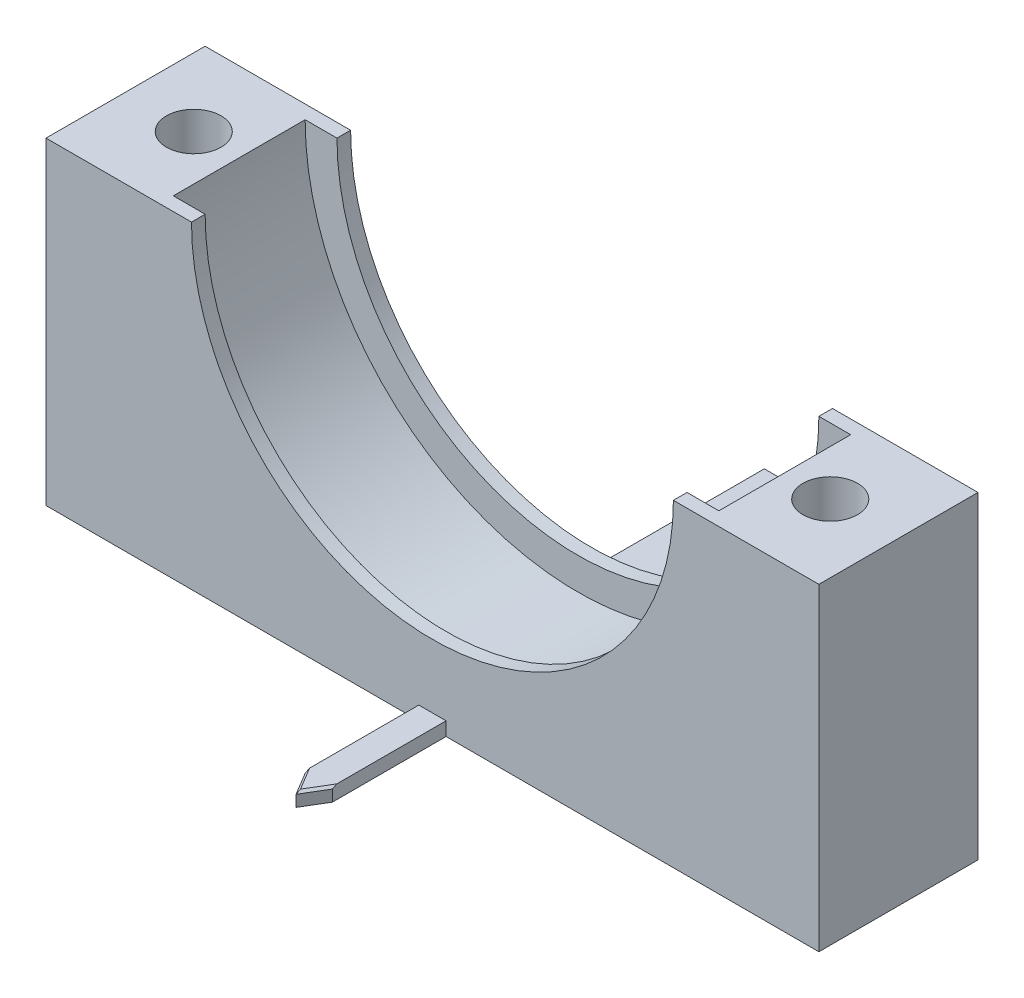
ISO-10303-21;
HEADER;
FILE_DESCRIPTION(('STEP AP214'),'2;1');
FILE_NAME('part.step','',(''),(''),'','','');
FILE_SCHEMA(('AUTOMOTIVE_DESIGN { 1 0 10303 214 1 1 1 1 }'));
ENDSEC;
DATA;
#1=APPLICATION_CONTEXT('core data for automotive mechanical design processes');
#2=APPLICATION_PROTOCOL_DEFINITION('international standard','automotive_design',2000,#1);
#3=PRODUCT_CONTEXT('',#1,'mechanical');
#4=PRODUCT('Part','Part','',(#3));
#5=PRODUCT_RELATED_PRODUCT_CATEGORY('part','',(#4));
#6=PRODUCT_DEFINITION_FORMATION('','',#4);
#7=PRODUCT_DEFINITION_CONTEXT('part definition',#1,'design');
#8=PRODUCT_DEFINITION('design','',#6,#7);
#9=PRODUCT_DEFINITION_SHAPE('','',#8);
#10=(LENGTH_UNIT() NAMED_UNIT(*) SI_UNIT(.MILLI.,.METRE.));
#11=(NAMED_UNIT(*) PLANE_ANGLE_UNIT() SI_UNIT($,.RADIAN.));
#12=(NAMED_UNIT(*) SI_UNIT($,.STERADIAN.) SOLID_ANGLE_UNIT());
#13=UNCERTAINTY_MEASURE_WITH_UNIT(LENGTH_MEASURE(1.E-05),#10,'distance_accuracy_value','');
#14=(GEOMETRIC_REPRESENTATION_CONTEXT(3) GLOBAL_UNCERTAINTY_ASSIGNED_CONTEXT((#13)) GLOBAL_UNIT_ASSIGNED_CONTEXT((#10,
#11,#12)) REPRESENTATION_CONTEXT('',''));
#15=CARTESIAN_POINT('',(0.,0.,0.));
#16=DIRECTION('',(0.,0.,1.));
#17=DIRECTION('',(1.,0.,0.));
#18=AXIS2_PLACEMENT_3D('',#15,#16,#17);
#19=CARTESIAN_POINT('',(-85.,-70.,14.5));
#20=DIRECTION('',(0.,1.,0.));
#21=DIRECTION('',(0.,0.,1.));
#22=AXIS2_PLACEMENT_3D('',#19,#20,#21);
#23=PLANE('',#22);
#24=DIRECTION('',(0.,0.,-1.));
#25=VECTOR('',#24,1.);
#26=CARTESIAN_POINT('',(-85.,-70.,14.5));
#27=LINE('',#26,#25);
#28=CARTESIAN_POINT('',(-85.,-70.,17.5));
#29=VERTEX_POINT('',#28);
#30=CARTESIAN_POINT('',(-85.,-70.,-17.5));
#31=VERTEX_POINT('',#30);
#32=EDGE_CURVE('E419',#29,#31,#27,.T.);
#33=ORIENTED_EDGE('',*,*,#32,.T.);
#34=DIRECTION('',(-1.,0.,0.));
#35=VECTOR('',#34,1.);
#36=CARTESIAN_POINT('',(85.,-70.,-17.5));
#37=LINE('',#36,#35);
#38=CARTESIAN_POINT('',(-9.99999999999999,-70.,-17.5));
#39=VERTEX_POINT('',#38);
#40=EDGE_CURVE('E380',#39,#31,#37,.T.);
#41=ORIENTED_EDGE('',*,*,#40,.F.);
#42=DIRECTION('',(0.,0.,-1.));
#43=VECTOR('',#42,1.);
#44=CARTESIAN_POINT('',(-10.,-70.,-17.5));
#45=LINE('',#44,#43);
#46=CARTESIAN_POINT('',(-10.,-70.,-62.5));
#47=VERTEX_POINT('',#46);
#48=EDGE_CURVE('E479',#39,#47,#45,.T.);
#49=ORIENTED_EDGE('',*,*,#48,.T.);
#50=DIRECTION('',(1.,0.,0.));
#51=VECTOR('',#50,1.);
#52=CARTESIAN_POINT('',(-10.,-70.,-62.5));
#53=LINE('',#52,#51);
#54=CARTESIAN_POINT('',(10.,-70.,-62.5));
#55=VERTEX_POINT('',#54);
#56=EDGE_CURVE('E439',#47,#55,#53,.T.);
#57=ORIENTED_EDGE('',*,*,#56,.T.);
#58=DIRECTION('',(0.,0.,-1.));
#59=VECTOR('',#58,1.);
#60=CARTESIAN_POINT('',(10.,-70.,-17.5));
#61=LINE('',#60,#59);
#62=CARTESIAN_POINT('',(10.,-70.,-17.5));
#63=VERTEX_POINT('',#62);
#64=EDGE_CURVE('E457',#63,#55,#61,.T.);
#65=ORIENTED_EDGE('',*,*,#64,.F.);
#66=CARTESIAN_POINT('',(85.,-70.,-17.5));
#67=VERTEX_POINT('',#66);
#68=EDGE_CURVE('E389',#67,#63,#37,.T.);
#69=ORIENTED_EDGE('',*,*,#68,.F.);
#70=DIRECTION('',(0.,0.,-1.));
#71=VECTOR('',#70,1.);
#72=CARTESIAN_POINT('',(85.,-70.,14.5));
#73=LINE('',#72,#71);
#74=CARTESIAN_POINT('',(85.,-70.,17.5));
#75=VERTEX_POINT('',#74);
#76=EDGE_CURVE('E416',#75,#67,#73,.T.);
#77=ORIENTED_EDGE('',*,*,#76,.F.);
#78=DIRECTION('',(1.,0.,0.));
#79=VECTOR('',#78,1.);
#80=CARTESIAN_POINT('',(-85.,-70.,17.5));
#81=LINE('',#80,#79);
#82=CARTESIAN_POINT('',(3.,-70.,17.5));
#83=VERTEX_POINT('',#82);
#84=EDGE_CURVE('E337',#83,#75,#81,.T.);
#85=ORIENTED_EDGE('',*,*,#84,.F.);
#86=DIRECTION('',(0.,0.,-1.));
#87=VECTOR('',#86,1.);
#88=CARTESIAN_POINT('',(3.,-70.,0.));
#89=LINE('',#88,#87);
#90=CARTESIAN_POINT('',(3.00000000000001,-70.,42.5));
#91=VERTEX_POINT('',#90);
#92=EDGE_CURVE('E223',#91,#83,#89,.T.);
#93=ORIENTED_EDGE('',*,*,#92,.F.);
#94=DIRECTION('',(-0.514495755427526,0.,0.857492925712545));
#95=VECTOR('',#94,1.);
#96=CARTESIAN_POINT('',(20.9558823529412,-70.,12.5735294117647));
#97=LINE('',#96,#95);
#98=CARTESIAN_POINT('',(0.,-70.,47.5));
#99=VERTEX_POINT('',#98);
#100=EDGE_CURVE('E236',#91,#99,#97,.T.);
#101=ORIENTED_EDGE('',*,*,#100,.T.);
#102=DIRECTION('',(0.514495755427526,0.,0.857492925712544));
#103=VECTOR('',#102,1.);
#104=CARTESIAN_POINT('',(-20.9558823529412,-70.,12.5735294117647));
#105=LINE('',#104,#103);
#106=CARTESIAN_POINT('',(-3.,-70.,42.5));
#107=VERTEX_POINT('',#106);
#108=EDGE_CURVE('E217',#107,#99,#105,.T.);
#109=ORIENTED_EDGE('',*,*,#108,.F.);
#110=DIRECTION('',(0.,0.,1.));
#111=VECTOR('',#110,1.);
#112=CARTESIAN_POINT('',(-3.,-70.,0.));
#113=LINE('',#112,#111);
#114=CARTESIAN_POINT('',(-3.,-70.,17.5));
#115=VERTEX_POINT('',#114);
#116=EDGE_CURVE('E242',#115,#107,#113,.T.);
#117=ORIENTED_EDGE('',*,*,#116,.F.);
#118=EDGE_CURVE('E341',#29,#115,#81,.T.);
#119=ORIENTED_EDGE('',*,*,#118,.F.);
#120=EDGE_LOOP('',(#33,#41,#49,#57,#65,#69,#77,#85,#93,#101,#109,#117,#119));
#121=FACE_BOUND('',#120,.T.);
#122=CARTESIAN_POINT('',(0.,-70.,0.));
#123=DIRECTION('',(0.,1.,0.));
#124=DIRECTION('',(0.,0.,1.));
#125=AXIS2_PLACEMENT_3D('',#122,#123,#124);
#126=CIRCLE('',#125,5.);
#127=CARTESIAN_POINT('',(0.,-70.,5.));
#128=VERTEX_POINT('',#127);
#129=EDGE_CURVE('E270',#128,#128,#126,.F.);
#130=ORIENTED_EDGE('',*,*,#129,.F.);
#131=EDGE_LOOP('',(#130));
#132=FACE_BOUND('',#131,.T.);
#133=ADVANCED_FACE('F36',(#121,#132),#23,.F.);
#134=CARTESIAN_POINT('',(0.,-87.,0.));
#135=DIRECTION('',(0.,-1.,0.));
#136=DIRECTION('',(0.,0.,-1.));
#137=AXIS2_PLACEMENT_3D('',#134,#135,#136);
#138=PLANE('',#137);
#139=DIRECTION('',(0.,0.,1.));
#140=VECTOR('',#139,1.);
#141=CARTESIAN_POINT('',(10.,-87.,-65.5));
#142=LINE('',#141,#140);
#143=CARTESIAN_POINT('',(10.,-87.,-62.5));
#144=VERTEX_POINT('',#143);
#145=CARTESIAN_POINT('',(10.,-87.,-35.5));
#146=VERTEX_POINT('',#145);
#147=EDGE_CURVE('E492',#144,#146,#142,.T.);
#148=ORIENTED_EDGE('',*,*,#147,.F.);
#149=DIRECTION('',(-1.,0.,0.));
#150=VECTOR('',#149,1.);
#151=CARTESIAN_POINT('',(-10.,-87.,-62.5));
#152=LINE('',#151,#150);
#153=CARTESIAN_POINT('',(-10.,-87.,-62.5));
#154=VERTEX_POINT('',#153);
#155=EDGE_CURVE('E433',#144,#154,#152,.T.);
#156=ORIENTED_EDGE('',*,*,#155,.T.);
#157=DIRECTION('',(0.,0.,-1.));
#158=VECTOR('',#157,1.);
#159=CARTESIAN_POINT('',(-10.,-87.,-65.5));
#160=LINE('',#159,#158);
#161=CARTESIAN_POINT('',(-10.,-87.,-35.5));
#162=VERTEX_POINT('',#161);
#163=EDGE_CURVE('E497',#162,#154,#160,.T.);
#164=ORIENTED_EDGE('',*,*,#163,.F.);
#165=DIRECTION('',(-1.,0.,0.));
#166=VECTOR('',#165,1.);
#167=CARTESIAN_POINT('',(10.,-87.,-35.5));
#168=LINE('',#167,#166);
#169=EDGE_CURVE('E495',#146,#162,#168,.T.);
#170=ORIENTED_EDGE('',*,*,#169,.F.);
#171=EDGE_LOOP('',(#148,#156,#164,#170));
#172=FACE_BOUND('',#171,.T.);
#173=CARTESIAN_POINT('',(0.,-87.,-40.9973008712896));
#174=DIRECTION('',(0.,-1.,0.));
#175=DIRECTION('',(0.,0.,-1.));
#176=AXIS2_PLACEMENT_3D('',#173,#174,#175);
#177=CIRCLE('',#176,4.);
#178=CARTESIAN_POINT('',(0.,-87.,-44.9973008712896));
#179=VERTEX_POINT('',#178);
#180=EDGE_CURVE('E262',#179,#179,#177,.F.);
#181=ORIENTED_EDGE('',*,*,#180,.F.);
#182=EDGE_LOOP('',(#181));
#183=FACE_BOUND('',#182,.T.);
#184=ADVANCED_FACE('F287',(#172,#183),#138,.F.);
#185=CARTESIAN_POINT('',(0.,0.,14.5));
#186=DIRECTION('',(0.,0.,-1.));
#187=DIRECTION('',(-1.,0.,0.));
#188=AXIS2_PLACEMENT_3D('',#185,#186,#187);
#189=CYLINDRICAL_SURFACE('',#188,60.);
#190=CARTESIAN_POINT('',(0.,0.,-14.5));
#191=DIRECTION('',(0.,0.,-1.));
#192=DIRECTION('',(-1.,0.,0.));
#193=AXIS2_PLACEMENT_3D('',#190,#191,#192);
#194=CIRCLE('',#193,60.);
#195=CARTESIAN_POINT('',(60.,0.,-14.5));
#196=VERTEX_POINT('',#195);
#197=CARTESIAN_POINT('',(-60.,0.,-14.5));
#198=VERTEX_POINT('',#197);
#199=EDGE_CURVE('E397',#196,#198,#194,.T.);
#200=ORIENTED_EDGE('',*,*,#199,.T.);
#201=DIRECTION('',(0.,0.,-1.));
#202=VECTOR('',#201,1.);
#203=CARTESIAN_POINT('',(-60.,0.,14.5));
#204=LINE('',#203,#202);
#205=CARTESIAN_POINT('',(-60.,0.,14.5));
#206=VERTEX_POINT('',#205);
#207=EDGE_CURVE('E426',#206,#198,#204,.T.);
#208=ORIENTED_EDGE('',*,*,#207,.F.);
#209=CARTESIAN_POINT('',(0.,0.,14.5));
#210=DIRECTION('',(0.,0.,-1.));
#211=DIRECTION('',(-1.,0.,0.));
#212=AXIS2_PLACEMENT_3D('',#209,#210,#211);
#213=CIRCLE('',#212,60.);
#214=CARTESIAN_POINT('',(60.,0.,14.5));
#215=VERTEX_POINT('',#214);
#216=EDGE_CURVE('E392',#215,#206,#213,.T.);
#217=ORIENTED_EDGE('',*,*,#216,.F.);
#218=DIRECTION('',(0.,0.,-1.));
#219=VECTOR('',#218,1.);
#220=CARTESIAN_POINT('',(60.,0.,14.5));
#221=LINE('',#220,#219);
#222=EDGE_CURVE('E396',#215,#196,#221,.T.);
#223=ORIENTED_EDGE('',*,*,#222,.T.);
#224=EDGE_LOOP('',(#200,#208,#217,#223));
#225=FACE_BOUND('',#224,.T.);
#226=ADVANCED_FACE('F293',(#225),#189,.F.);
#227=CARTESIAN_POINT('',(-60.,0.,14.5));
#228=DIRECTION('',(0.,-1.,0.));
#229=DIRECTION('',(1.,0.,0.));
#230=AXIS2_PLACEMENT_3D('',#227,#228,#229);
#231=PLANE('',#230);
#232=CARTESIAN_POINT('',(-70.,0.,0.));
#233=DIRECTION('',(0.,1.,0.));
#234=DIRECTION('',(0.,0.,1.));
#235=AXIS2_PLACEMENT_3D('',#232,#233,#234);
#236=CIRCLE('',#235,5.99999999999999);
#237=CARTESIAN_POINT('',(-70.,0.,6.));
#238=VERTEX_POINT('',#237);
#239=EDGE_CURVE('E633',#238,#238,#236,.T.);
#240=ORIENTED_EDGE('',*,*,#239,.F.);
#241=EDGE_LOOP('',(#240));
#242=FACE_BOUND('',#241,.T.);
#243=ORIENTED_EDGE('',*,*,#207,.T.);
#244=DIRECTION('',(1.,0.,0.));
#245=VECTOR('',#244,1.);
#246=CARTESIAN_POINT('',(-85.,0.,-14.5));
#247=LINE('',#246,#245);
#248=CARTESIAN_POINT('',(-53.,0.,-14.5));
#249=VERTEX_POINT('',#248);
#250=EDGE_CURVE('E374',#198,#249,#247,.T.);
#251=ORIENTED_EDGE('',*,*,#250,.T.);
#252=DIRECTION('',(0.,0.,1.));
#253=VECTOR('',#252,1.);
#254=CARTESIAN_POINT('',(-53.,0.,-17.5));
#255=LINE('',#254,#253);
#256=CARTESIAN_POINT('',(-53.,0.,-17.5));
#257=VERTEX_POINT('',#256);
#258=EDGE_CURVE('E650',#257,#249,#255,.T.);
#259=ORIENTED_EDGE('',*,*,#258,.F.);
#260=DIRECTION('',(1.,0.,0.));
#261=VECTOR('',#260,1.);
#262=CARTESIAN_POINT('',(-85.,0.,-17.5));
#263=LINE('',#262,#261);
#264=CARTESIAN_POINT('',(-85.,0.,-17.5));
#265=VERTEX_POINT('',#264);
#266=EDGE_CURVE('E652',#265,#257,#263,.T.);
#267=ORIENTED_EDGE('',*,*,#266,.F.);
#268=DIRECTION('',(0.,0.,-1.));
#269=VECTOR('',#268,1.);
#270=CARTESIAN_POINT('',(-85.,0.,14.5));
#271=LINE('',#270,#269);
#272=CARTESIAN_POINT('',(-85.,0.,17.5));
#273=VERTEX_POINT('',#272);
#274=EDGE_CURVE('E423',#273,#265,#271,.T.);
#275=ORIENTED_EDGE('',*,*,#274,.F.);
#276=DIRECTION('',(-1.,0.,0.));
#277=VECTOR('',#276,1.);
#278=CARTESIAN_POINT('',(-53.,0.,17.5));
#279=LINE('',#278,#277);
#280=CARTESIAN_POINT('',(-53.,0.,17.5));
#281=VERTEX_POINT('',#280);
#282=EDGE_CURVE('E675',#281,#273,#279,.T.);
#283=ORIENTED_EDGE('',*,*,#282,.F.);
#284=DIRECTION('',(0.,0.,-1.));
#285=VECTOR('',#284,1.);
#286=CARTESIAN_POINT('',(-53.,0.,17.5));
#287=LINE('',#286,#285);
#288=CARTESIAN_POINT('',(-53.,0.,14.5));
#289=VERTEX_POINT('',#288);
#290=EDGE_CURVE('E659',#281,#289,#287,.T.);
#291=ORIENTED_EDGE('',*,*,#290,.T.);
#292=DIRECTION('',(-1.,0.,0.));
#293=VECTOR('',#292,1.);
#294=CARTESIAN_POINT('',(-53.,0.,14.5));
#295=LINE('',#294,#293);
#296=EDGE_CURVE('E358',#289,#206,#295,.T.);
#297=ORIENTED_EDGE('',*,*,#296,.T.);
#298=EDGE_LOOP('',(#243,#251,#259,#267,#275,#283,#291,#297));
#299=FACE_BOUND('',#298,.T.);
#300=ADVANCED_FACE('F305',(#242,#299),#231,.F.);
#301=CARTESIAN_POINT('',(-85.,-30.5,14.5));
#302=DIRECTION('',(1.,0.,0.));
#303=DIRECTION('',(0.,0.,-1.));
#304=AXIS2_PLACEMENT_3D('',#301,#302,#303);
#305=PLANE('',#304);
#306=ORIENTED_EDGE('',*,*,#274,.T.);
#307=DIRECTION('',(0.,1.,0.));
#308=VECTOR('',#307,1.);
#309=CARTESIAN_POINT('',(-85.,-70.,-17.5));
#310=LINE('',#309,#308);
#311=EDGE_CURVE('E383',#31,#265,#310,.T.);
#312=ORIENTED_EDGE('',*,*,#311,.F.);
#313=ORIENTED_EDGE('',*,*,#32,.F.);
#314=DIRECTION('',(0.,-1.,0.));
#315=VECTOR('',#314,1.);
#316=CARTESIAN_POINT('',(-85.,0.,17.5));
#317=LINE('',#316,#315);
#318=EDGE_CURVE('E342',#273,#29,#317,.T.);
#319=ORIENTED_EDGE('',*,*,#318,.F.);
#320=EDGE_LOOP('',(#306,#312,#313,#319));
#321=FACE_BOUND('',#320,.T.);
#322=ADVANCED_FACE('F302',(#321),#305,.F.);
#323=CARTESIAN_POINT('',(85.,-30.5,14.5));
#324=DIRECTION('',(-1.,0.,0.));
#325=DIRECTION('',(0.,0.,1.));
#326=AXIS2_PLACEMENT_3D('',#323,#324,#325);
#327=PLANE('',#326);
#328=ORIENTED_EDGE('',*,*,#76,.T.);
#329=DIRECTION('',(0.,-1.,0.));
#330=VECTOR('',#329,1.);
#331=CARTESIAN_POINT('',(85.,0.,-17.5));
#332=LINE('',#331,#330);
#333=CARTESIAN_POINT('',(85.,0.,-17.5));
#334=VERTEX_POINT('',#333);
#335=EDGE_CURVE('E377',#334,#67,#332,.T.);
#336=ORIENTED_EDGE('',*,*,#335,.F.);
#337=DIRECTION('',(0.,0.,-1.));
#338=VECTOR('',#337,1.);
#339=CARTESIAN_POINT('',(85.,0.,14.5));
#340=LINE('',#339,#338);
#341=CARTESIAN_POINT('',(85.,0.,17.5));
#342=VERTEX_POINT('',#341);
#343=EDGE_CURVE('E407',#342,#334,#340,.T.);
#344=ORIENTED_EDGE('',*,*,#343,.F.);
#345=DIRECTION('',(0.,1.,0.));
#346=VECTOR('',#345,1.);
#347=CARTESIAN_POINT('',(85.,-70.,17.5));
#348=LINE('',#347,#346);
#349=EDGE_CURVE('E348',#75,#342,#348,.T.);
#350=ORIENTED_EDGE('',*,*,#349,.F.);
#351=EDGE_LOOP('',(#328,#336,#344,#350));
#352=FACE_BOUND('',#351,.T.);
#353=ADVANCED_FACE('F300',(#352),#327,.F.);
#354=CARTESIAN_POINT('',(60.,0.,14.5));
#355=DIRECTION('',(0.,-1.,0.));
#356=DIRECTION('',(1.,0.,0.));
#357=AXIS2_PLACEMENT_3D('',#354,#355,#356);
#358=PLANE('',#357);
#359=CARTESIAN_POINT('',(70.,0.,0.));
#360=DIRECTION('',(0.,1.,0.));
#361=DIRECTION('',(0.,0.,1.));
#362=AXIS2_PLACEMENT_3D('',#359,#360,#361);
#363=CIRCLE('',#362,5.99999999999999);
#364=CARTESIAN_POINT('',(70.,0.,5.99999999999999));
#365=VERTEX_POINT('',#364);
#366=EDGE_CURVE('E628',#365,#365,#363,.T.);
#367=ORIENTED_EDGE('',*,*,#366,.F.);
#368=EDGE_LOOP('',(#367));
#369=FACE_BOUND('',#368,.T.);
#370=ORIENTED_EDGE('',*,*,#343,.T.);
#371=DIRECTION('',(1.,0.,0.));
#372=VECTOR('',#371,1.);
#373=CARTESIAN_POINT('',(53.,0.,-17.5));
#374=LINE('',#373,#372);
#375=CARTESIAN_POINT('',(53.,0.,-17.5));
#376=VERTEX_POINT('',#375);
#377=EDGE_CURVE('E373',#376,#334,#374,.T.);
#378=ORIENTED_EDGE('',*,*,#377,.F.);
#379=DIRECTION('',(0.,0.,1.));
#380=VECTOR('',#379,1.);
#381=CARTESIAN_POINT('',(53.,0.,-17.5));
#382=LINE('',#381,#380);
#383=CARTESIAN_POINT('',(53.,0.,-14.5));
#384=VERTEX_POINT('',#383);
#385=EDGE_CURVE('E638',#376,#384,#382,.T.);
#386=ORIENTED_EDGE('',*,*,#385,.T.);
#387=DIRECTION('',(1.,0.,0.));
#388=VECTOR('',#387,1.);
#389=CARTESIAN_POINT('',(53.,0.,-14.5));
#390=LINE('',#389,#388);
#391=EDGE_CURVE('E639',#384,#196,#390,.T.);
#392=ORIENTED_EDGE('',*,*,#391,.T.);
#393=ORIENTED_EDGE('',*,*,#222,.F.);
#394=DIRECTION('',(-1.,0.,0.));
#395=VECTOR('',#394,1.);
#396=CARTESIAN_POINT('',(85.,0.,14.5));
#397=LINE('',#396,#395);
#398=CARTESIAN_POINT('',(53.,0.,14.5));
#399=VERTEX_POINT('',#398);
#400=EDGE_CURVE('E368',#215,#399,#397,.T.);
#401=ORIENTED_EDGE('',*,*,#400,.T.);
#402=DIRECTION('',(0.,0.,-1.));
#403=VECTOR('',#402,1.);
#404=CARTESIAN_POINT('',(53.,0.,17.5));
#405=LINE('',#404,#403);
#406=CARTESIAN_POINT('',(53.,0.,17.5));
#407=VERTEX_POINT('',#406);
#408=EDGE_CURVE('E354',#407,#399,#405,.T.);
#409=ORIENTED_EDGE('',*,*,#408,.F.);
#410=DIRECTION('',(-1.,0.,0.));
#411=VECTOR('',#410,1.);
#412=CARTESIAN_POINT('',(85.,0.,17.5));
#413=LINE('',#412,#411);
#414=EDGE_CURVE('E352',#342,#407,#413,.T.);
#415=ORIENTED_EDGE('',*,*,#414,.F.);
#416=EDGE_LOOP('',(#370,#378,#386,#392,#393,#401,#409,#415));
#417=FACE_BOUND('',#416,.T.);
#418=ADVANCED_FACE('F619',(#369,#417),#358,.F.);
#419=CARTESIAN_POINT('',(70.,-20.,0.));
#420=DIRECTION('',(0.,1.,0.));
#421=DIRECTION('',(0.,0.,1.));
#422=AXIS2_PLACEMENT_3D('',#419,#420,#421);
#423=CONICAL_SURFACE('',#422,5.99999999999999,1.02974425867665);
#424=CARTESIAN_POINT('',(70.,-23.6051637141654,0.));
#425=VERTEX_POINT('',#424);
#426=VERTEX_LOOP('',#425);
#427=FACE_BOUND('',#426,.T.);
#428=CARTESIAN_POINT('',(70.,-20.,0.));
#429=DIRECTION('',(0.,1.,0.));
#430=DIRECTION('',(0.,0.,1.));
#431=AXIS2_PLACEMENT_3D('',#428,#429,#430);
#432=CIRCLE('',#431,5.99999999999999);
#433=CARTESIAN_POINT('',(70.,-20.,5.99999999999999));
#434=VERTEX_POINT('',#433);
#435=EDGE_CURVE('E403',#434,#434,#432,.T.);
#436=ORIENTED_EDGE('',*,*,#435,.T.);
#437=EDGE_LOOP('',(#436));
#438=FACE_BOUND('',#437,.T.);
#439=ADVANCED_FACE('F616',(#427,#438),#423,.F.);
#440=CARTESIAN_POINT('',(70.,0.,0.));
#441=DIRECTION('',(0.,1.,0.));
#442=DIRECTION('',(0.,0.,1.));
#443=AXIS2_PLACEMENT_3D('',#440,#441,#442);
#444=CYLINDRICAL_SURFACE('',#443,5.99999999999999);
#445=ORIENTED_EDGE('',*,*,#435,.F.);
#446=EDGE_LOOP('',(#445));
#447=FACE_BOUND('',#446,.T.);
#448=ORIENTED_EDGE('',*,*,#366,.T.);
#449=EDGE_LOOP('',(#448));
#450=FACE_BOUND('',#449,.T.);
#451=ADVANCED_FACE('F612',(#447,#450),#444,.F.);
#452=CARTESIAN_POINT('',(-70.,-20.,0.));
#453=DIRECTION('',(0.,1.,0.));
#454=DIRECTION('',(0.,0.,1.));
#455=AXIS2_PLACEMENT_3D('',#452,#453,#454);
#456=CONICAL_SURFACE('',#455,5.99999999999999,1.02974425867665);
#457=CARTESIAN_POINT('',(-70.,-23.6051637141654,0.));
#458=VERTEX_POINT('',#457);
#459=VERTEX_LOOP('',#458);
#460=FACE_BOUND('',#459,.T.);
#461=CARTESIAN_POINT('',(-70.,-20.,0.));
#462=DIRECTION('',(0.,1.,0.));
#463=DIRECTION('',(0.,0.,1.));
#464=AXIS2_PLACEMENT_3D('',#461,#462,#463);
#465=CIRCLE('',#464,5.99999999999999);
#466=CARTESIAN_POINT('',(-70.,-20.,6.));
#467=VERTEX_POINT('',#466);
#468=EDGE_CURVE('E630',#467,#467,#465,.T.);
#469=ORIENTED_EDGE('',*,*,#468,.T.);
#470=EDGE_LOOP('',(#469));
#471=FACE_BOUND('',#470,.T.);
#472=ADVANCED_FACE('F608',(#460,#471),#456,.F.);
#473=CARTESIAN_POINT('',(-70.,0.,0.));
#474=DIRECTION('',(0.,1.,0.));
#475=DIRECTION('',(0.,0.,1.));
#476=AXIS2_PLACEMENT_3D('',#473,#474,#475);
#477=CYLINDRICAL_SURFACE('',#476,5.99999999999999);
#478=ORIENTED_EDGE('',*,*,#468,.F.);
#479=EDGE_LOOP('',(#478));
#480=FACE_BOUND('',#479,.T.);
#481=ORIENTED_EDGE('',*,*,#239,.T.);
#482=EDGE_LOOP('',(#481));
#483=FACE_BOUND('',#482,.T.);
#484=ADVANCED_FACE('F604',(#480,#483),#477,.F.);
#485=CARTESIAN_POINT('',(0.,0.,-17.5));
#486=DIRECTION('',(0.,0.,1.));
#487=DIRECTION('',(1.,0.,0.));
#488=AXIS2_PLACEMENT_3D('',#485,#486,#487);
#489=CYLINDRICAL_SURFACE('',#488,53.);
#490=CARTESIAN_POINT('',(0.,0.,-14.5));
#491=DIRECTION('',(0.,0.,1.));
#492=DIRECTION('',(-1.,0.,0.));
#493=AXIS2_PLACEMENT_3D('',#490,#491,#492);
#494=CIRCLE('',#493,53.);
#495=EDGE_CURVE('E643',#249,#384,#494,.T.);
#496=ORIENTED_EDGE('',*,*,#495,.T.);
#497=ORIENTED_EDGE('',*,*,#385,.F.);
#498=CARTESIAN_POINT('',(0.,0.,-17.5));
#499=DIRECTION('',(0.,0.,1.));
#500=DIRECTION('',(-1.,0.,0.));
#501=AXIS2_PLACEMENT_3D('',#498,#499,#500);
#502=CIRCLE('',#501,53.);
#503=EDGE_CURVE('E370',#257,#376,#502,.T.);
#504=ORIENTED_EDGE('',*,*,#503,.F.);
#505=ORIENTED_EDGE('',*,*,#258,.T.);
#506=EDGE_LOOP('',(#496,#497,#504,#505));
#507=FACE_BOUND('',#506,.T.);
#508=ADVANCED_FACE('F597',(#507),#489,.F.);
#509=CARTESIAN_POINT('',(0.,0.,-17.5));
#510=DIRECTION('',(0.,0.,-1.));
#511=DIRECTION('',(-1.,0.,0.));
#512=AXIS2_PLACEMENT_3D('',#509,#510,#511);
#513=PLANE('',#512);
#514=DIRECTION('',(0.,-1.,0.));
#515=VECTOR('',#514,1.);
#516=CARTESIAN_POINT('',(10.,-66.9999999999999,-17.5));
#517=LINE('',#516,#515);
#518=CARTESIAN_POINT('',(10.,-66.9999999999999,-17.5));
#519=VERTEX_POINT('',#518);
#520=EDGE_CURVE('E359',#519,#63,#517,.T.);
#521=ORIENTED_EDGE('',*,*,#520,.F.);
#522=DIRECTION('',(-1.,0.,0.));
#523=VECTOR('',#522,1.);
#524=CARTESIAN_POINT('',(0.,-66.9999999999999,-17.5));
#525=LINE('',#524,#523);
#526=CARTESIAN_POINT('',(-10.,-66.9999999999999,-17.5));
#527=VERTEX_POINT('',#526);
#528=EDGE_CURVE('E453',#519,#527,#525,.T.);
#529=ORIENTED_EDGE('',*,*,#528,.T.);
#530=DIRECTION('',(0.,-1.,0.));
#531=VECTOR('',#530,1.);
#532=CARTESIAN_POINT('',(-10.,-66.9999999999999,-17.5));
#533=LINE('',#532,#531);
#534=EDGE_CURVE('E460',#527,#39,#533,.T.);
#535=ORIENTED_EDGE('',*,*,#534,.T.);
#536=ORIENTED_EDGE('',*,*,#40,.T.);
#537=ORIENTED_EDGE('',*,*,#311,.T.);
#538=ORIENTED_EDGE('',*,*,#266,.T.);
#539=ORIENTED_EDGE('',*,*,#503,.T.);
#540=ORIENTED_EDGE('',*,*,#377,.T.);
#541=ORIENTED_EDGE('',*,*,#335,.T.);
#542=ORIENTED_EDGE('',*,*,#68,.T.);
#543=EDGE_LOOP('',(#521,#529,#535,#536,#537,#538,#539,#540,#541,#542));
#544=FACE_BOUND('',#543,.T.);
#545=ADVANCED_FACE('F594',(#544),#513,.T.);
#546=CARTESIAN_POINT('',(0.,0.,-14.5));
#547=DIRECTION('',(0.,0.,-1.));
#548=DIRECTION('',(-1.,0.,0.));
#549=AXIS2_PLACEMENT_3D('',#546,#547,#548);
#550=PLANE('',#549);
#551=ORIENTED_EDGE('',*,*,#199,.F.);
#552=ORIENTED_EDGE('',*,*,#391,.F.);
#553=ORIENTED_EDGE('',*,*,#495,.F.);
#554=ORIENTED_EDGE('',*,*,#250,.F.);
#555=EDGE_LOOP('',(#551,#552,#553,#554));
#556=FACE_BOUND('',#555,.T.);
#557=ADVANCED_FACE('F589',(#556),#550,.F.);
#558=CARTESIAN_POINT('',(0.,0.,14.5));
#559=DIRECTION('',(0.,0.,1.));
#560=DIRECTION('',(1.,0.,0.));
#561=AXIS2_PLACEMENT_3D('',#558,#559,#560);
#562=PLANE('',#561);
#563=ORIENTED_EDGE('',*,*,#400,.F.);
#564=ORIENTED_EDGE('',*,*,#216,.T.);
#565=ORIENTED_EDGE('',*,*,#296,.F.);
#566=CARTESIAN_POINT('',(0.,0.,14.5));
#567=DIRECTION('',(0.,0.,-1.));
#568=DIRECTION('',(1.,0.,0.));
#569=AXIS2_PLACEMENT_3D('',#566,#567,#568);
#570=CIRCLE('',#569,53.);
#571=EDGE_CURVE('E355',#399,#289,#570,.T.);
#572=ORIENTED_EDGE('',*,*,#571,.F.);
#573=EDGE_LOOP('',(#563,#564,#565,#572));
#574=FACE_BOUND('',#573,.T.);
#575=ADVANCED_FACE('F586',(#574),#562,.F.);
#576=CARTESIAN_POINT('',(0.,0.,17.5));
#577=DIRECTION('',(0.,0.,-1.));
#578=DIRECTION('',(-1.,0.,0.));
#579=AXIS2_PLACEMENT_3D('',#576,#577,#578);
#580=CYLINDRICAL_SURFACE('',#579,53.);
#581=ORIENTED_EDGE('',*,*,#571,.T.);
#582=ORIENTED_EDGE('',*,*,#290,.F.);
#583=CARTESIAN_POINT('',(0.,0.,17.5));
#584=DIRECTION('',(0.,0.,-1.));
#585=DIRECTION('',(1.,0.,0.));
#586=AXIS2_PLACEMENT_3D('',#583,#584,#585);
#587=CIRCLE('',#586,53.);
#588=EDGE_CURVE('E465',#407,#281,#587,.T.);
#589=ORIENTED_EDGE('',*,*,#588,.F.);
#590=ORIENTED_EDGE('',*,*,#408,.T.);
#591=EDGE_LOOP('',(#581,#582,#589,#590));
#592=FACE_BOUND('',#591,.T.);
#593=ADVANCED_FACE('F585',(#592),#580,.F.);
#594=CARTESIAN_POINT('',(0.,0.,17.5));
#595=DIRECTION('',(0.,0.,1.));
#596=DIRECTION('',(1.,0.,0.));
#597=AXIS2_PLACEMENT_3D('',#594,#595,#596);
#598=PLANE('',#597);
#599=DIRECTION('',(0.,-1.,0.));
#600=VECTOR('',#599,1.);
#601=CARTESIAN_POINT('',(-3.,-66.9999999999999,17.5));
#602=LINE('',#601,#600);
#603=CARTESIAN_POINT('',(-3.,-66.9999999999999,17.5));
#604=VERTEX_POINT('',#603);
#605=EDGE_CURVE('E227',#604,#115,#602,.T.);
#606=ORIENTED_EDGE('',*,*,#605,.F.);
#607=DIRECTION('',(1.,0.,0.));
#608=VECTOR('',#607,1.);
#609=CARTESIAN_POINT('',(0.,-66.9999999999999,17.5));
#610=LINE('',#609,#608);
#611=CARTESIAN_POINT('',(3.,-66.9999999999999,17.5));
#612=VERTEX_POINT('',#611);
#613=EDGE_CURVE('E212',#604,#612,#610,.T.);
#614=ORIENTED_EDGE('',*,*,#613,.T.);
#615=DIRECTION('',(0.,-1.,0.));
#616=VECTOR('',#615,1.);
#617=CARTESIAN_POINT('',(3.,-66.9999999999999,17.5));
#618=LINE('',#617,#616);
#619=EDGE_CURVE('E220',#612,#83,#618,.T.);
#620=ORIENTED_EDGE('',*,*,#619,.T.);
#621=ORIENTED_EDGE('',*,*,#84,.T.);
#622=ORIENTED_EDGE('',*,*,#349,.T.);
#623=ORIENTED_EDGE('',*,*,#414,.T.);
#624=ORIENTED_EDGE('',*,*,#588,.T.);
#625=ORIENTED_EDGE('',*,*,#282,.T.);
#626=ORIENTED_EDGE('',*,*,#318,.T.);
#627=ORIENTED_EDGE('',*,*,#118,.T.);
#628=EDGE_LOOP('',(#606,#614,#620,#621,#622,#623,#624,#625,#626,#627));
#629=FACE_BOUND('',#628,.T.);
#630=ADVANCED_FACE('F229',(#629),#598,.T.);
#631=CARTESIAN_POINT('',(10.,-66.9999999999999,-17.5));
#632=DIRECTION('',(-1.,0.,0.));
#633=DIRECTION('',(0.,0.,1.));
#634=AXIS2_PLACEMENT_3D('',#631,#632,#633);
#635=PLANE('',#634);
#636=ORIENTED_EDGE('',*,*,#64,.T.);
#637=DIRECTION('',(0.,-1.,0.));
#638=VECTOR('',#637,1.);
#639=CARTESIAN_POINT('',(10.,-87.,-62.5));
#640=LINE('',#639,#638);
#641=EDGE_CURVE('E438',#55,#144,#640,.T.);
#642=ORIENTED_EDGE('',*,*,#641,.T.);
#643=ORIENTED_EDGE('',*,*,#147,.T.);
#644=DIRECTION('',(0.,1.,0.));
#645=VECTOR('',#644,1.);
#646=CARTESIAN_POINT('',(10.,-90.,-35.5));
#647=LINE('',#646,#645);
#648=CARTESIAN_POINT('',(10.,-90.,-35.5));
#649=VERTEX_POINT('',#648);
#650=EDGE_CURVE('E509',#649,#146,#647,.T.);
#651=ORIENTED_EDGE('',*,*,#650,.F.);
#652=DIRECTION('',(0.,0.,1.));
#653=VECTOR('',#652,1.);
#654=CARTESIAN_POINT('',(10.,-90.,-65.5));
#655=LINE('',#654,#653);
#656=CARTESIAN_POINT('',(10.,-90.,-65.5));
#657=VERTEX_POINT('',#656);
#658=EDGE_CURVE('E533',#657,#649,#655,.T.);
#659=ORIENTED_EDGE('',*,*,#658,.F.);
#660=DIRECTION('',(0.,-1.,0.));
#661=VECTOR('',#660,1.);
#662=CARTESIAN_POINT('',(10.,-87.,-65.5));
#663=LINE('',#662,#661);
#664=CARTESIAN_POINT('',(10.,-66.9999999999999,-65.5));
#665=VERTEX_POINT('',#664);
#666=EDGE_CURVE('E452',#665,#657,#663,.T.);
#667=ORIENTED_EDGE('',*,*,#666,.F.);
#668=DIRECTION('',(0.,0.,-1.));
#669=VECTOR('',#668,1.);
#670=CARTESIAN_POINT('',(10.,-66.9999999999999,-17.5));
#671=LINE('',#670,#669);
#672=EDGE_CURVE('E459',#519,#665,#671,.T.);
#673=ORIENTED_EDGE('',*,*,#672,.F.);
#674=ORIENTED_EDGE('',*,*,#520,.T.);
#675=EDGE_LOOP('',(#636,#642,#643,#651,#659,#667,#673,#674));
#676=FACE_BOUND('',#675,.T.);
#677=ADVANCED_FACE('F516',(#676),#635,.F.);
#678=CARTESIAN_POINT('',(-10.,-66.9999999999999,-17.5));
#679=DIRECTION('',(-1.,0.,0.));
#680=DIRECTION('',(0.,0.,1.));
#681=AXIS2_PLACEMENT_3D('',#678,#679,#680);
#682=PLANE('',#681);
#683=ORIENTED_EDGE('',*,*,#48,.F.);
#684=ORIENTED_EDGE('',*,*,#534,.F.);
#685=DIRECTION('',(0.,0.,-1.));
#686=VECTOR('',#685,1.);
#687=CARTESIAN_POINT('',(-10.,-66.9999999999999,-17.5));
#688=LINE('',#687,#686);
#689=CARTESIAN_POINT('',(-10.,-66.9999999999999,-65.5));
#690=VERTEX_POINT('',#689);
#691=EDGE_CURVE('E456',#527,#690,#688,.T.);
#692=ORIENTED_EDGE('',*,*,#691,.T.);
#693=DIRECTION('',(0.,1.,0.));
#694=VECTOR('',#693,1.);
#695=CARTESIAN_POINT('',(-10.,-66.9999999999999,-65.5));
#696=LINE('',#695,#694);
#697=CARTESIAN_POINT('',(-10.,-90.,-65.5));
#698=VERTEX_POINT('',#697);
#699=EDGE_CURVE('E484',#698,#690,#696,.T.);
#700=ORIENTED_EDGE('',*,*,#699,.F.);
#701=DIRECTION('',(0.,0.,-1.));
#702=VECTOR('',#701,1.);
#703=CARTESIAN_POINT('',(-10.,-90.,-65.5));
#704=LINE('',#703,#702);
#705=CARTESIAN_POINT('',(-10.,-90.,-35.5));
#706=VERTEX_POINT('',#705);
#707=EDGE_CURVE('E503',#706,#698,#704,.T.);
#708=ORIENTED_EDGE('',*,*,#707,.F.);
#709=DIRECTION('',(0.,1.,0.));
#710=VECTOR('',#709,1.);
#711=CARTESIAN_POINT('',(-10.,-90.,-35.5));
#712=LINE('',#711,#710);
#713=EDGE_CURVE('E507',#706,#162,#712,.T.);
#714=ORIENTED_EDGE('',*,*,#713,.T.);
#715=ORIENTED_EDGE('',*,*,#163,.T.);
#716=DIRECTION('',(0.,1.,0.));
#717=VECTOR('',#716,1.);
#718=CARTESIAN_POINT('',(-10.,-66.9999999999999,-62.5));
#719=LINE('',#718,#717);
#720=EDGE_CURVE('E437',#154,#47,#719,.T.);
#721=ORIENTED_EDGE('',*,*,#720,.T.);
#722=EDGE_LOOP('',(#683,#684,#692,#700,#708,#714,#715,#721));
#723=FACE_BOUND('',#722,.T.);
#724=ADVANCED_FACE('F527',(#723),#682,.T.);
#725=CARTESIAN_POINT('',(0.,-66.9999999999999,0.));
#726=DIRECTION('',(0.,-1.,0.));
#727=DIRECTION('',(0.,0.,-1.));
#728=AXIS2_PLACEMENT_3D('',#725,#726,#727);
#729=PLANE('',#728);
#730=ORIENTED_EDGE('',*,*,#528,.F.);
#731=ORIENTED_EDGE('',*,*,#672,.T.);
#732=DIRECTION('',(1.,0.,0.));
#733=VECTOR('',#732,1.);
#734=CARTESIAN_POINT('',(10.,-66.9999999999999,-65.5));
#735=LINE('',#734,#733);
#736=EDGE_CURVE('E481',#690,#665,#735,.T.);
#737=ORIENTED_EDGE('',*,*,#736,.F.);
#738=ORIENTED_EDGE('',*,*,#691,.F.);
#739=EDGE_LOOP('',(#730,#731,#737,#738));
#740=FACE_BOUND('',#739,.T.);
#741=ADVANCED_FACE('F575',(#740),#729,.F.);
#742=CARTESIAN_POINT('',(0.,0.,-62.5));
#743=DIRECTION('',(0.,0.,1.));
#744=DIRECTION('',(1.,0.,0.));
#745=AXIS2_PLACEMENT_3D('',#742,#743,#744);
#746=PLANE('',#745);
#747=ORIENTED_EDGE('',*,*,#56,.F.);
#748=ORIENTED_EDGE('',*,*,#720,.F.);
#749=ORIENTED_EDGE('',*,*,#155,.F.);
#750=ORIENTED_EDGE('',*,*,#641,.F.);
#751=EDGE_LOOP('',(#747,#748,#749,#750));
#752=FACE_BOUND('',#751,.T.);
#753=ADVANCED_FACE('F519',(#752),#746,.T.);
#754=CARTESIAN_POINT('',(0.,0.,-65.5));
#755=DIRECTION('',(0.,0.,1.));
#756=DIRECTION('',(1.,0.,0.));
#757=AXIS2_PLACEMENT_3D('',#754,#755,#756);
#758=PLANE('',#757);
#759=ORIENTED_EDGE('',*,*,#666,.T.);
#760=DIRECTION('',(1.,0.,0.));
#761=VECTOR('',#760,1.);
#762=CARTESIAN_POINT('',(-10.,-90.,-65.5));
#763=LINE('',#762,#761);
#764=EDGE_CURVE('E534',#698,#657,#763,.T.);
#765=ORIENTED_EDGE('',*,*,#764,.F.);
#766=ORIENTED_EDGE('',*,*,#699,.T.);
#767=ORIENTED_EDGE('',*,*,#736,.T.);
#768=EDGE_LOOP('',(#759,#765,#766,#767));
#769=FACE_BOUND('',#768,.T.);
#770=ADVANCED_FACE('F570',(#769),#758,.F.);
#771=CARTESIAN_POINT('',(10.,-90.,-35.5));
#772=DIRECTION('',(0.,0.,-1.));
#773=DIRECTION('',(-1.,0.,0.));
#774=AXIS2_PLACEMENT_3D('',#771,#772,#773);
#775=PLANE('',#774);
#776=ORIENTED_EDGE('',*,*,#169,.T.);
#777=ORIENTED_EDGE('',*,*,#713,.F.);
#778=DIRECTION('',(-1.,0.,0.));
#779=VECTOR('',#778,1.);
#780=CARTESIAN_POINT('',(10.,-90.,-35.5));
#781=LINE('',#780,#779);
#782=EDGE_CURVE('E532',#649,#706,#781,.T.);
#783=ORIENTED_EDGE('',*,*,#782,.F.);
#784=ORIENTED_EDGE('',*,*,#650,.T.);
#785=EDGE_LOOP('',(#776,#777,#783,#784));
#786=FACE_BOUND('',#785,.T.);
#787=ADVANCED_FACE('F524',(#786),#775,.F.);
#788=CARTESIAN_POINT('',(0.,-90.,0.));
#789=DIRECTION('',(0.,-1.,0.));
#790=DIRECTION('',(0.,0.,-1.));
#791=AXIS2_PLACEMENT_3D('',#788,#789,#790);
#792=PLANE('',#791);
#793=CARTESIAN_POINT('',(0.,-90.,-40.9973008712896));
#794=DIRECTION('',(0.,-1.,0.));
#795=DIRECTION('',(0.,0.,-1.));
#796=AXIS2_PLACEMENT_3D('',#793,#794,#795);
#797=CIRCLE('',#796,2.);
#798=CARTESIAN_POINT('',(0.,-90.,-42.9973008712896));
#799=VERTEX_POINT('',#798);
#800=EDGE_CURVE('E496',#799,#799,#797,.T.);
#801=ORIENTED_EDGE('',*,*,#800,.F.);
#802=EDGE_LOOP('',(#801));
#803=FACE_BOUND('',#802,.T.);
#804=ORIENTED_EDGE('',*,*,#764,.T.);
#805=ORIENTED_EDGE('',*,*,#658,.T.);
#806=ORIENTED_EDGE('',*,*,#782,.T.);
#807=ORIENTED_EDGE('',*,*,#707,.T.);
#808=EDGE_LOOP('',(#804,#805,#806,#807));
#809=FACE_BOUND('',#808,.T.);
#810=ADVANCED_FACE('F560',(#803,#809),#792,.T.);
#811=CARTESIAN_POINT('',(0.,-82.,-40.9973008712896));
#812=DIRECTION('',(0.,-1.,0.));
#813=DIRECTION('',(0.,0.,-1.));
#814=AXIS2_PLACEMENT_3D('',#811,#812,#813);
#815=CYLINDRICAL_SURFACE('',#814,2.);
#816=ORIENTED_EDGE('',*,*,#800,.T.);
#817=EDGE_LOOP('',(#816));
#818=FACE_BOUND('',#817,.T.);
#819=CARTESIAN_POINT('',(0.,-81.9999999999999,-40.9973008712896));
#820=DIRECTION('',(0.,1.,0.));
#821=DIRECTION('',(0.,0.,1.));
#822=AXIS2_PLACEMENT_3D('',#819,#820,#821);
#823=CIRCLE('',#822,2.);
#824=CARTESIAN_POINT('',(0.,-81.9999999999999,-38.9973008712896));
#825=VERTEX_POINT('',#824);
#826=EDGE_CURVE('E542',#825,#825,#823,.T.);
#827=ORIENTED_EDGE('',*,*,#826,.T.);
#828=EDGE_LOOP('',(#827));
#829=FACE_BOUND('',#828,.T.);
#830=ADVANCED_FACE('F546',(#818,#829),#815,.F.);
#831=CARTESIAN_POINT('',(0.,-81.9999999999999,-40.9973008712896));
#832=DIRECTION('',(0.,-1.,0.));
#833=DIRECTION('',(0.,0.,-1.));
#834=AXIS2_PLACEMENT_3D('',#831,#832,#833);
#835=CYLINDRICAL_SURFACE('',#834,4.);
#836=CARTESIAN_POINT('',(0.,-81.9999999999999,-40.9973008712896));
#837=DIRECTION('',(0.,1.,0.));
#838=DIRECTION('',(0.,0.,1.));
#839=AXIS2_PLACEMENT_3D('',#836,#837,#838);
#840=CIRCLE('',#839,4.);
#841=CARTESIAN_POINT('',(0.,-81.9999999999999,-36.9973008712896));
#842=VERTEX_POINT('',#841);
#843=EDGE_CURVE('E540',#842,#842,#840,.T.);
#844=ORIENTED_EDGE('',*,*,#843,.F.);
#845=EDGE_LOOP('',(#844));
#846=FACE_BOUND('',#845,.T.);
#847=ORIENTED_EDGE('',*,*,#180,.T.);
#848=EDGE_LOOP('',(#847));
#849=FACE_BOUND('',#848,.T.);
#850=ADVANCED_FACE('F551',(#846,#849),#835,.T.);
#851=CARTESIAN_POINT('',(0.,-81.9999999999999,-40.9973008712896));
#852=DIRECTION('',(0.,1.,0.));
#853=DIRECTION('',(0.,0.,1.));
#854=AXIS2_PLACEMENT_3D('',#851,#852,#853);
#855=PLANE('',#854);
#856=ORIENTED_EDGE('',*,*,#826,.F.);
#857=EDGE_LOOP('',(#856));
#858=FACE_BOUND('',#857,.T.);
#859=ORIENTED_EDGE('',*,*,#843,.T.);
#860=EDGE_LOOP('',(#859));
#861=FACE_BOUND('',#860,.T.);
#862=ADVANCED_FACE('F548',(#858,#861),#855,.T.);
#863=CARTESIAN_POINT('',(20.9558823529412,-66.9999999999999,12.5735294117647));
#864=DIRECTION('',(0.857492925712544,0.,0.514495755427526));
#865=DIRECTION('',(0.514495755427526,0.,-0.857492925712545));
#866=AXIS2_PLACEMENT_3D('',#863,#864,#865);
#867=PLANE('',#866);
#868=DIRECTION('',(0.,-1.,0.));
#869=VECTOR('',#868,1.);
#870=CARTESIAN_POINT('',(3.00000000000001,-66.9999999999999,42.5));
#871=LINE('',#870,#869);
#872=CARTESIAN_POINT('',(3.,-67.4999999999999,42.5));
#873=VERTEX_POINT('',#872);
#874=EDGE_CURVE('E226',#873,#91,#871,.T.);
#875=ORIENTED_EDGE('',*,*,#874,.F.);
#876=DIRECTION('',(-0.514495755427526,0.,0.857492925712545));
#877=VECTOR('',#876,1.);
#878=CARTESIAN_POINT('',(20.9558823529412,-67.4999999999999,12.5735294117647));
#879=LINE('',#878,#877);
#880=CARTESIAN_POINT('',(0.,-67.4999999999999,47.5));
#881=VERTEX_POINT('',#880);
#882=EDGE_CURVE('E267',#873,#881,#879,.T.);
#883=ORIENTED_EDGE('',*,*,#882,.T.);
#884=DIRECTION('',(0.,-1.,0.));
#885=VECTOR('',#884,1.);
#886=CARTESIAN_POINT('',(0.,-66.9999999999999,47.5));
#887=LINE('',#886,#885);
#888=EDGE_CURVE('E233',#881,#99,#887,.T.);
#889=ORIENTED_EDGE('',*,*,#888,.T.);
#890=ORIENTED_EDGE('',*,*,#100,.F.);
#891=EDGE_LOOP('',(#875,#883,#889,#890));
#892=FACE_BOUND('',#891,.T.);
#893=ADVANCED_FACE('F327',(#892),#867,.T.);
#894=CARTESIAN_POINT('',(3.,-66.9999999999999,0.));
#895=DIRECTION('',(-1.,0.,0.));
#896=DIRECTION('',(0.,0.,1.));
#897=AXIS2_PLACEMENT_3D('',#894,#895,#896);
#898=PLANE('',#897);
#899=DIRECTION('',(0.,0.,-1.));
#900=VECTOR('',#899,1.);
#901=CARTESIAN_POINT('',(3.,-66.9999999999999,0.));
#902=LINE('',#901,#900);
#903=CARTESIAN_POINT('',(3.,-66.9999999999999,41.5281746841924));
#904=VERTEX_POINT('',#903);
#905=EDGE_CURVE('E207',#904,#612,#902,.T.);
#906=ORIENTED_EDGE('',*,*,#905,.F.);
#907=DIRECTION('',(0.,0.457495710997803,-0.889211827642106));
#908=VECTOR('',#907,1.);
#909=CARTESIAN_POINT('',(3.,-55.3255946244767,18.8372093023253));
#910=LINE('',#909,#908);
#911=EDGE_CURVE('E51',#904,#873,#910,.F.);
#912=ORIENTED_EDGE('',*,*,#911,.T.);
#913=ORIENTED_EDGE('',*,*,#874,.T.);
#914=ORIENTED_EDGE('',*,*,#92,.T.);
#915=ORIENTED_EDGE('',*,*,#619,.F.);
#916=EDGE_LOOP('',(#906,#912,#913,#914,#915));
#917=FACE_BOUND('',#916,.T.);
#918=ADVANCED_FACE('F221',(#917),#898,.F.);
#919=CARTESIAN_POINT('',(-3.,-66.9999999999999,0.));
#920=DIRECTION('',(1.,0.,0.));
#921=DIRECTION('',(0.,0.,-1.));
#922=AXIS2_PLACEMENT_3D('',#919,#920,#921);
#923=PLANE('',#922);
#924=DIRECTION('',(0.,-1.,0.));
#925=VECTOR('',#924,1.);
#926=CARTESIAN_POINT('',(-3.,-66.9999999999999,42.5));
#927=LINE('',#926,#925);
#928=CARTESIAN_POINT('',(-3.,-67.4999999999999,42.5));
#929=VERTEX_POINT('',#928);
#930=EDGE_CURVE('E244',#929,#107,#927,.T.);
#931=ORIENTED_EDGE('',*,*,#930,.F.);
#932=DIRECTION('',(0.,0.457495710997798,-0.889211827642109));
#933=VECTOR('',#932,1.);
#934=CARTESIAN_POINT('',(-3.,-55.1162922988954,18.4303987050103));
#935=LINE('',#934,#933);
#936=CARTESIAN_POINT('',(-3.,-66.9999999999999,41.5281746841924));
#937=VERTEX_POINT('',#936);
#938=EDGE_CURVE('E265',#929,#937,#935,.T.);
#939=ORIENTED_EDGE('',*,*,#938,.T.);
#940=DIRECTION('',(0.,0.,1.));
#941=VECTOR('',#940,1.);
#942=CARTESIAN_POINT('',(-3.,-66.9999999999999,0.));
#943=LINE('',#942,#941);
#944=EDGE_CURVE('E231',#604,#937,#943,.T.);
#945=ORIENTED_EDGE('',*,*,#944,.F.);
#946=ORIENTED_EDGE('',*,*,#605,.T.);
#947=ORIENTED_EDGE('',*,*,#116,.T.);
#948=EDGE_LOOP('',(#931,#939,#945,#946,#947));
#949=FACE_BOUND('',#948,.T.);
#950=ADVANCED_FACE('F333',(#949),#923,.F.);
#951=CARTESIAN_POINT('',(-20.9558823529412,-66.9999999999999,12.5735294117647));
#952=DIRECTION('',(0.857492925712544,0.,-0.514495755427526));
#953=DIRECTION('',(-0.514495755427526,0.,-0.857492925712544));
#954=AXIS2_PLACEMENT_3D('',#951,#952,#953);
#955=PLANE('',#954);
#956=ORIENTED_EDGE('',*,*,#888,.F.);
#957=DIRECTION('',(-0.514495755427526,0.,-0.857492925712544));
#958=VECTOR('',#957,1.);
#959=CARTESIAN_POINT('',(-3.,-67.4999999999999,42.5));
#960=LINE('',#959,#958);
#961=EDGE_CURVE('E59',#881,#929,#960,.T.);
#962=ORIENTED_EDGE('',*,*,#961,.T.);
#963=ORIENTED_EDGE('',*,*,#930,.T.);
#964=ORIENTED_EDGE('',*,*,#108,.T.);
#965=EDGE_LOOP('',(#956,#962,#963,#964));
#966=FACE_BOUND('',#965,.T.);
#967=ADVANCED_FACE('F322',(#966),#955,.F.);
#968=CARTESIAN_POINT('',(0.,-66.9999999999999,0.));
#969=DIRECTION('',(0.,1.,0.));
#970=DIRECTION('',(0.,0.,1.));
#971=AXIS2_PLACEMENT_3D('',#968,#969,#970);
#972=PLANE('',#971);
#973=ORIENTED_EDGE('',*,*,#944,.T.);
#974=DIRECTION('',(0.514495755427526,0.,0.857492925712544));
#975=VECTOR('',#974,1.);
#976=CARTESIAN_POINT('',(0.428746462856292,-66.9999999999999,47.2427521222862));
#977=LINE('',#976,#975);
#978=CARTESIAN_POINT('',(0.,-66.9999999999999,46.5281746841924));
#979=VERTEX_POINT('',#978);
#980=EDGE_CURVE('E261',#937,#979,#977,.T.);
#981=ORIENTED_EDGE('',*,*,#980,.T.);
#982=DIRECTION('',(0.514495755427526,0.,-0.857492925712545));
#983=VECTOR('',#982,1.);
#984=CARTESIAN_POINT('',(20.5271358900849,-66.9999999999999,12.3162815340509));
#985=LINE('',#984,#983);
#986=EDGE_CURVE('E216',#979,#904,#985,.T.);
#987=ORIENTED_EDGE('',*,*,#986,.T.);
#988=ORIENTED_EDGE('',*,*,#905,.T.);
#989=ORIENTED_EDGE('',*,*,#613,.F.);
#990=EDGE_LOOP('',(#973,#981,#987,#988,#989));
#991=FACE_BOUND('',#990,.T.);
#992=ADVANCED_FACE('F210',(#991),#972,.T.);
#993=CARTESIAN_POINT('',(20.9558823529412,-67.4999999999999,12.5735294117647));
#994=DIRECTION('',(-0.606339062590824,-0.707106781186558,-0.363803437554494));
#995=DIRECTION('',(-0.514495755427526,0.,0.857492925712545));
#996=AXIS2_PLACEMENT_3D('',#993,#994,#995);
#997=PLANE('',#996);
#998=ORIENTED_EDGE('',*,*,#911,.F.);
#999=ORIENTED_EDGE('',*,*,#986,.F.);
#1000=DIRECTION('',(0.,0.4574957109978,-0.889211827642107));
#1001=VECTOR('',#1000,1.);
#1002=CARTESIAN_POINT('',(1.28369537222284E-13,-53.2915416379028,19.883720930232));
#1003=LINE('',#1002,#1001);
#1004=EDGE_CURVE('E239',#881,#979,#1003,.T.);
#1005=ORIENTED_EDGE('',*,*,#1004,.F.);
#1006=ORIENTED_EDGE('',*,*,#882,.F.);
#1007=EDGE_LOOP('',(#998,#999,#1005,#1006));
#1008=FACE_BOUND('',#1007,.T.);
#1009=ADVANCED_FACE('F315',(#1008),#997,.F.);
#1010=CARTESIAN_POINT('',(-20.5271358900849,-66.9999999999999,12.3162815340509));
#1011=DIRECTION('',(-0.606339062590819,0.707106781186563,0.363803437554491));
#1012=DIRECTION('',(-0.514495755427526,0.,-0.857492925712544));
#1013=AXIS2_PLACEMENT_3D('',#1010,#1011,#1012);
#1014=PLANE('',#1013);
#1015=ORIENTED_EDGE('',*,*,#938,.F.);
#1016=ORIENTED_EDGE('',*,*,#961,.F.);
#1017=ORIENTED_EDGE('',*,*,#1004,.T.);
#1018=ORIENTED_EDGE('',*,*,#980,.F.);
#1019=EDGE_LOOP('',(#1015,#1016,#1017,#1018));
#1020=FACE_BOUND('',#1019,.T.);
#1021=ADVANCED_FACE('F313',(#1020),#1014,.T.);
#1022=CARTESIAN_POINT('',(0.,-80.,0.));
#1023=DIRECTION('',(0.,1.,0.));
#1024=DIRECTION('',(0.,0.,1.));
#1025=AXIS2_PLACEMENT_3D('',#1022,#1023,#1024);
#1026=CYLINDRICAL_SURFACE('',#1025,5.);
#1027=CARTESIAN_POINT('',(0.,-79.,0.));
#1028=DIRECTION('',(0.,-1.,0.));
#1029=DIRECTION('',(0.,0.,-1.));
#1030=AXIS2_PLACEMENT_3D('',#1027,#1028,#1029);
#1031=CIRCLE('',#1030,5.);
#1032=CARTESIAN_POINT('',(0.,-79.,-5.));
#1033=VERTEX_POINT('',#1032);
#1034=EDGE_CURVE('E11',#1033,#1033,#1031,.F.);
#1035=ORIENTED_EDGE('',*,*,#1034,.T.);
#1036=EDGE_LOOP('',(#1035));
#1037=FACE_BOUND('',#1036,.T.);
#1038=ORIENTED_EDGE('',*,*,#129,.T.);
#1039=EDGE_LOOP('',(#1038));
#1040=FACE_BOUND('',#1039,.T.);
#1041=ADVANCED_FACE('F283',(#1037,#1040),#1026,.T.);
#1042=CARTESIAN_POINT('',(0.,-80.,0.));
#1043=DIRECTION('',(0.,-1.,0.));
#1044=DIRECTION('',(0.,0.,-1.));
#1045=AXIS2_PLACEMENT_3D('',#1042,#1043,#1044);
#1046=PLANE('',#1045);
#1047=CARTESIAN_POINT('',(0.,-80.,0.));
#1048=DIRECTION('',(0.,-1.,0.));
#1049=DIRECTION('',(0.,0.,-1.));
#1050=AXIS2_PLACEMENT_3D('',#1047,#1048,#1049);
#1051=CIRCLE('',#1050,4.00000000000006);
#1052=CARTESIAN_POINT('',(0.,-80.,-4.00000000000006));
#1053=VERTEX_POINT('',#1052);
#1054=EDGE_CURVE('E44',#1053,#1053,#1051,.T.);
#1055=ORIENTED_EDGE('',*,*,#1054,.T.);
#1056=EDGE_LOOP('',(#1055));
#1057=FACE_BOUND('',#1056,.T.);
#1058=ADVANCED_FACE('F276',(#1057),#1046,.T.);
#1059=CARTESIAN_POINT('',(0.,-80.,0.));
#1060=DIRECTION('',(0.,1.,0.));
#1061=DIRECTION('',(0.,0.,1.));
#1062=AXIS2_PLACEMENT_3D('',#1059,#1060,#1061);
#1063=CONICAL_SURFACE('',#1062,4.00000000000006,0.785398163397439);
#1064=ORIENTED_EDGE('',*,*,#1034,.F.);
#1065=EDGE_LOOP('',(#1064));
#1066=FACE_BOUND('',#1065,.T.);
#1067=ORIENTED_EDGE('',*,*,#1054,.F.);
#1068=EDGE_LOOP('',(#1067));
#1069=FACE_BOUND('',#1068,.T.);
#1070=ADVANCED_FACE('F38',(#1066,#1069),#1063,.T.);
#1071=CLOSED_SHELL('',(#133,#184,#226,#300,#322,#353,#418,#439,#451,#472,#484,#508,#545,#557,
#575,#593,#630,#677,#724,#741,#753,#770,#787,#810,#830,#850,#862,#893,#918,#950,#967,#992,#1009,
#1021,#1041,#1058,#1070));
#1072=MANIFOLD_SOLID_BREP('B2',#1071);
#1073=ADVANCED_BREP_SHAPE_REPRESENTATION('',(#18,#1072),#14);
#1074=SHAPE_DEFINITION_REPRESENTATION(#9,#1073);
ENDSEC;
END-ISO-10303-21;
